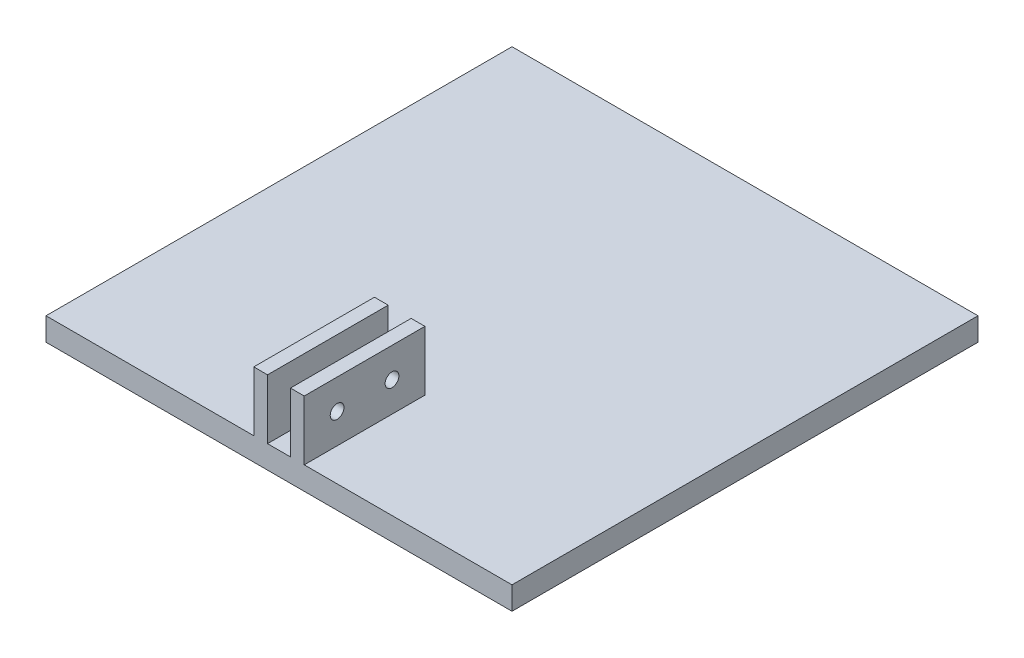
ISO-10303-21;
HEADER;
FILE_DESCRIPTION(('STEP AP214'),'2;1');
FILE_NAME('part.step','',(''),(''),'','','');
FILE_SCHEMA(('AUTOMOTIVE_DESIGN { 1 0 10303 214 1 1 1 1 }'));
ENDSEC;
DATA;
#1=APPLICATION_CONTEXT('core data for automotive mechanical design processes');
#2=APPLICATION_PROTOCOL_DEFINITION('international standard','automotive_design',2000,#1);
#3=PRODUCT_CONTEXT('',#1,'mechanical');
#4=PRODUCT('Part','Part','',(#3));
#5=PRODUCT_RELATED_PRODUCT_CATEGORY('part','',(#4));
#6=PRODUCT_DEFINITION_FORMATION('','',#4);
#7=PRODUCT_DEFINITION_CONTEXT('part definition',#1,'design');
#8=PRODUCT_DEFINITION('design','',#6,#7);
#9=PRODUCT_DEFINITION_SHAPE('','',#8);
#10=(LENGTH_UNIT() NAMED_UNIT(*) SI_UNIT(.MILLI.,.METRE.));
#11=(NAMED_UNIT(*) PLANE_ANGLE_UNIT() SI_UNIT($,.RADIAN.));
#12=(NAMED_UNIT(*) SI_UNIT($,.STERADIAN.) SOLID_ANGLE_UNIT());
#13=UNCERTAINTY_MEASURE_WITH_UNIT(LENGTH_MEASURE(1.E-05),#10,'distance_accuracy_value','');
#14=(GEOMETRIC_REPRESENTATION_CONTEXT(3) GLOBAL_UNCERTAINTY_ASSIGNED_CONTEXT((#13)) GLOBAL_UNIT_ASSIGNED_CONTEXT((#10,
#11,#12)) REPRESENTATION_CONTEXT('',''));
#15=CARTESIAN_POINT('',(0.,0.,0.));
#16=DIRECTION('',(0.,0.,1.));
#17=DIRECTION('',(1.,0.,0.));
#18=AXIS2_PLACEMENT_3D('',#15,#16,#17);
#19=CARTESIAN_POINT('',(0.,5.,0.));
#20=DIRECTION('',(0.,1.,0.));
#21=DIRECTION('',(0.,0.,1.));
#22=AXIS2_PLACEMENT_3D('',#19,#20,#21);
#23=PLANE('',#22);
#24=DIRECTION('',(-1.,0.,0.));
#25=VECTOR('',#24,1.);
#26=CARTESIAN_POINT('',(-2.49999999999997,5.,24.49));
#27=LINE('',#26,#25);
#28=CARTESIAN_POINT('',(-2.49999999999997,5.,24.49));
#29=VERTEX_POINT('',#28);
#30=CARTESIAN_POINT('',(-5.49999999999997,5.,24.49));
#31=VERTEX_POINT('',#30);
#32=EDGE_CURVE('E50',#29,#31,#27,.T.);
#33=ORIENTED_EDGE('',*,*,#32,.F.);
#34=DIRECTION('',(0.,0.,-1.));
#35=VECTOR('',#34,1.);
#36=CARTESIAN_POINT('',(-2.49999999999997,5.,50.8));
#37=LINE('',#36,#35);
#38=CARTESIAN_POINT('',(-2.49999999999997,5.,50.8));
#39=VERTEX_POINT('',#38);
#40=EDGE_CURVE('E144',#39,#29,#37,.T.);
#41=ORIENTED_EDGE('',*,*,#40,.F.);
#42=DIRECTION('',(1.,0.,0.));
#43=VECTOR('',#42,1.);
#44=CARTESIAN_POINT('',(50.8,5.,50.8));
#45=LINE('',#44,#43);
#46=CARTESIAN_POINT('',(2.5,5.,50.8));
#47=VERTEX_POINT('',#46);
#48=EDGE_CURVE('E189',#39,#47,#45,.T.);
#49=ORIENTED_EDGE('',*,*,#48,.T.);
#50=DIRECTION('',(0.,0.,1.));
#51=VECTOR('',#50,1.);
#52=CARTESIAN_POINT('',(2.5,5.,50.8));
#53=LINE('',#52,#51);
#54=CARTESIAN_POINT('',(2.5,5.,24.49));
#55=VERTEX_POINT('',#54);
#56=EDGE_CURVE('E145',#55,#47,#53,.T.);
#57=ORIENTED_EDGE('',*,*,#56,.F.);
#58=DIRECTION('',(-1.,0.,0.));
#59=VECTOR('',#58,1.);
#60=CARTESIAN_POINT('',(2.5,5.,24.49));
#61=LINE('',#60,#59);
#62=CARTESIAN_POINT('',(5.5,5.,24.49));
#63=VERTEX_POINT('',#62);
#64=EDGE_CURVE('E158',#63,#55,#61,.T.);
#65=ORIENTED_EDGE('',*,*,#64,.F.);
#66=DIRECTION('',(0.,0.,-1.));
#67=VECTOR('',#66,1.);
#68=CARTESIAN_POINT('',(5.5,5.,50.8));
#69=LINE('',#68,#67);
#70=CARTESIAN_POINT('',(5.5,5.,50.8));
#71=VERTEX_POINT('',#70);
#72=EDGE_CURVE('E148',#71,#63,#69,.T.);
#73=ORIENTED_EDGE('',*,*,#72,.F.);
#74=CARTESIAN_POINT('',(50.8,5.,50.8));
#75=VERTEX_POINT('',#74);
#76=EDGE_CURVE('E184',#71,#75,#45,.T.);
#77=ORIENTED_EDGE('',*,*,#76,.T.);
#78=DIRECTION('',(0.,0.,-1.));
#79=VECTOR('',#78,1.);
#80=CARTESIAN_POINT('',(50.8,5.,50.8));
#81=LINE('',#80,#79);
#82=CARTESIAN_POINT('',(50.8,5.,-50.8));
#83=VERTEX_POINT('',#82);
#84=EDGE_CURVE('E188',#75,#83,#81,.T.);
#85=ORIENTED_EDGE('',*,*,#84,.T.);
#86=DIRECTION('',(-1.,0.,0.));
#87=VECTOR('',#86,1.);
#88=CARTESIAN_POINT('',(50.8,5.,-50.8));
#89=LINE('',#88,#87);
#90=CARTESIAN_POINT('',(-50.8,5.,-50.8));
#91=VERTEX_POINT('',#90);
#92=EDGE_CURVE('E191',#83,#91,#89,.T.);
#93=ORIENTED_EDGE('',*,*,#92,.T.);
#94=DIRECTION('',(0.,0.,1.));
#95=VECTOR('',#94,1.);
#96=CARTESIAN_POINT('',(-50.8,5.,50.8));
#97=LINE('',#96,#95);
#98=CARTESIAN_POINT('',(-50.8,5.,50.8));
#99=VERTEX_POINT('',#98);
#100=EDGE_CURVE('E181',#91,#99,#97,.T.);
#101=ORIENTED_EDGE('',*,*,#100,.T.);
#102=CARTESIAN_POINT('',(-5.49999999999996,5.,50.8));
#103=VERTEX_POINT('',#102);
#104=EDGE_CURVE('E186',#99,#103,#45,.T.);
#105=ORIENTED_EDGE('',*,*,#104,.T.);
#106=DIRECTION('',(0.,0.,1.));
#107=VECTOR('',#106,1.);
#108=CARTESIAN_POINT('',(-5.49999999999997,5.,50.8));
#109=LINE('',#108,#107);
#110=EDGE_CURVE('E55',#31,#103,#109,.T.);
#111=ORIENTED_EDGE('',*,*,#110,.F.);
#112=EDGE_LOOP('',(#33,#41,#49,#57,#65,#73,#77,#85,#93,#101,#105,#111));
#113=FACE_BOUND('',#112,.T.);
#114=ADVANCED_FACE('F33',(#113),#23,.T.);
#115=CARTESIAN_POINT('',(-50.8,5.,50.8));
#116=DIRECTION('',(1.,0.,0.));
#117=DIRECTION('',(0.,0.,-1.));
#118=AXIS2_PLACEMENT_3D('',#115,#116,#117);
#119=PLANE('',#118);
#120=DIRECTION('',(0.,0.,1.));
#121=VECTOR('',#120,1.);
#122=CARTESIAN_POINT('',(-50.8,0.,50.8));
#123=LINE('',#122,#121);
#124=CARTESIAN_POINT('',(-50.8,0.,-50.8));
#125=VERTEX_POINT('',#124);
#126=CARTESIAN_POINT('',(-50.8,0.,50.8));
#127=VERTEX_POINT('',#126);
#128=EDGE_CURVE('E180',#125,#127,#123,.T.);
#129=ORIENTED_EDGE('',*,*,#128,.T.);
#130=DIRECTION('',(0.,-1.,0.));
#131=VECTOR('',#130,1.);
#132=CARTESIAN_POINT('',(-50.8,5.,50.8));
#133=LINE('',#132,#131);
#134=EDGE_CURVE('E11',#99,#127,#133,.T.);
#135=ORIENTED_EDGE('',*,*,#134,.F.);
#136=ORIENTED_EDGE('',*,*,#100,.F.);
#137=DIRECTION('',(0.,-1.,0.));
#138=VECTOR('',#137,1.);
#139=CARTESIAN_POINT('',(-50.8,5.,-50.8));
#140=LINE('',#139,#138);
#141=EDGE_CURVE('E193',#91,#125,#140,.T.);
#142=ORIENTED_EDGE('',*,*,#141,.T.);
#143=EDGE_LOOP('',(#129,#135,#136,#142));
#144=FACE_BOUND('',#143,.T.);
#145=ADVANCED_FACE('F35',(#144),#119,.F.);
#146=CARTESIAN_POINT('',(50.8,5.,50.8));
#147=DIRECTION('',(0.,0.,-1.));
#148=DIRECTION('',(-1.,0.,0.));
#149=AXIS2_PLACEMENT_3D('',#146,#147,#148);
#150=PLANE('',#149);
#151=DIRECTION('',(1.,0.,0.));
#152=VECTOR('',#151,1.);
#153=CARTESIAN_POINT('',(50.8,0.,50.8));
#154=LINE('',#153,#152);
#155=CARTESIAN_POINT('',(50.8,0.,50.8));
#156=VERTEX_POINT('',#155);
#157=EDGE_CURVE('E196',#127,#156,#154,.T.);
#158=ORIENTED_EDGE('',*,*,#157,.T.);
#159=DIRECTION('',(0.,-1.,0.));
#160=VECTOR('',#159,1.);
#161=CARTESIAN_POINT('',(50.8,5.,50.8));
#162=LINE('',#161,#160);
#163=EDGE_CURVE('E42',#75,#156,#162,.T.);
#164=ORIENTED_EDGE('',*,*,#163,.F.);
#165=ORIENTED_EDGE('',*,*,#76,.F.);
#166=DIRECTION('',(0.,-1.,0.));
#167=VECTOR('',#166,1.);
#168=CARTESIAN_POINT('',(5.5,18.,50.8));
#169=LINE('',#168,#167);
#170=CARTESIAN_POINT('',(5.5,18.,50.8));
#171=VERTEX_POINT('',#170);
#172=EDGE_CURVE('E174',#171,#71,#169,.T.);
#173=ORIENTED_EDGE('',*,*,#172,.F.);
#174=DIRECTION('',(1.,0.,0.));
#175=VECTOR('',#174,1.);
#176=CARTESIAN_POINT('',(2.5,18.,50.8));
#177=LINE('',#176,#175);
#178=CARTESIAN_POINT('',(2.5,18.,50.8));
#179=VERTEX_POINT('',#178);
#180=EDGE_CURVE('E157',#179,#171,#177,.T.);
#181=ORIENTED_EDGE('',*,*,#180,.F.);
#182=DIRECTION('',(0.,-1.,0.));
#183=VECTOR('',#182,1.);
#184=CARTESIAN_POINT('',(2.5,18.,50.8));
#185=LINE('',#184,#183);
#186=EDGE_CURVE('E177',#179,#47,#185,.T.);
#187=ORIENTED_EDGE('',*,*,#186,.T.);
#188=ORIENTED_EDGE('',*,*,#48,.F.);
#189=DIRECTION('',(0.,-1.,0.));
#190=VECTOR('',#189,1.);
#191=CARTESIAN_POINT('',(-2.49999999999997,18.,50.8));
#192=LINE('',#191,#190);
#193=CARTESIAN_POINT('',(-2.49999999999997,18.,50.8));
#194=VERTEX_POINT('',#193);
#195=EDGE_CURVE('E234',#194,#39,#192,.T.);
#196=ORIENTED_EDGE('',*,*,#195,.F.);
#197=DIRECTION('',(1.,0.,0.));
#198=VECTOR('',#197,1.);
#199=CARTESIAN_POINT('',(-2.49999999999997,18.,50.8));
#200=LINE('',#199,#198);
#201=CARTESIAN_POINT('',(-5.49999999999997,18.,50.8));
#202=VERTEX_POINT('',#201);
#203=EDGE_CURVE('E138',#202,#194,#200,.T.);
#204=ORIENTED_EDGE('',*,*,#203,.F.);
#205=DIRECTION('',(0.,-1.,0.));
#206=VECTOR('',#205,1.);
#207=CARTESIAN_POINT('',(-5.49999999999997,18.,50.8));
#208=LINE('',#207,#206);
#209=EDGE_CURVE('E150',#202,#103,#208,.T.);
#210=ORIENTED_EDGE('',*,*,#209,.T.);
#211=ORIENTED_EDGE('',*,*,#104,.F.);
#212=ORIENTED_EDGE('',*,*,#134,.T.);
#213=EDGE_LOOP('',(#158,#164,#165,#173,#181,#187,#188,#196,#204,#210,#211,#212));
#214=FACE_BOUND('',#213,.T.);
#215=ADVANCED_FACE('F241',(#214),#150,.F.);
#216=CARTESIAN_POINT('',(50.8,5.,50.8));
#217=DIRECTION('',(-1.,0.,0.));
#218=DIRECTION('',(0.,0.,1.));
#219=AXIS2_PLACEMENT_3D('',#216,#217,#218);
#220=PLANE('',#219);
#221=DIRECTION('',(0.,0.,-1.));
#222=VECTOR('',#221,1.);
#223=CARTESIAN_POINT('',(50.8,0.,50.8));
#224=LINE('',#223,#222);
#225=CARTESIAN_POINT('',(50.8,0.,-50.8));
#226=VERTEX_POINT('',#225);
#227=EDGE_CURVE('E198',#156,#226,#224,.T.);
#228=ORIENTED_EDGE('',*,*,#227,.T.);
#229=DIRECTION('',(0.,-1.,0.));
#230=VECTOR('',#229,1.);
#231=CARTESIAN_POINT('',(50.8,5.,-50.8));
#232=LINE('',#231,#230);
#233=EDGE_CURVE('E203',#83,#226,#232,.T.);
#234=ORIENTED_EDGE('',*,*,#233,.F.);
#235=ORIENTED_EDGE('',*,*,#84,.F.);
#236=ORIENTED_EDGE('',*,*,#163,.T.);
#237=EDGE_LOOP('',(#228,#234,#235,#236));
#238=FACE_BOUND('',#237,.T.);
#239=ADVANCED_FACE('F272',(#238),#220,.F.);
#240=CARTESIAN_POINT('',(50.8,5.,-50.8));
#241=DIRECTION('',(0.,0.,1.));
#242=DIRECTION('',(1.,0.,0.));
#243=AXIS2_PLACEMENT_3D('',#240,#241,#242);
#244=PLANE('',#243);
#245=DIRECTION('',(-1.,0.,0.));
#246=VECTOR('',#245,1.);
#247=CARTESIAN_POINT('',(50.8,0.,-50.8));
#248=LINE('',#247,#246);
#249=EDGE_CURVE('E185',#226,#125,#248,.T.);
#250=ORIENTED_EDGE('',*,*,#249,.T.);
#251=ORIENTED_EDGE('',*,*,#141,.F.);
#252=ORIENTED_EDGE('',*,*,#92,.F.);
#253=ORIENTED_EDGE('',*,*,#233,.T.);
#254=EDGE_LOOP('',(#250,#251,#252,#253));
#255=FACE_BOUND('',#254,.T.);
#256=ADVANCED_FACE('F268',(#255),#244,.F.);
#257=CARTESIAN_POINT('',(0.,0.,0.));
#258=DIRECTION('',(0.,1.,0.));
#259=DIRECTION('',(0.,0.,1.));
#260=AXIS2_PLACEMENT_3D('',#257,#258,#259);
#261=PLANE('',#260);
#262=ORIENTED_EDGE('',*,*,#128,.F.);
#263=ORIENTED_EDGE('',*,*,#249,.F.);
#264=ORIENTED_EDGE('',*,*,#227,.F.);
#265=ORIENTED_EDGE('',*,*,#157,.F.);
#266=EDGE_LOOP('',(#262,#263,#264,#265));
#267=FACE_BOUND('',#266,.T.);
#268=ADVANCED_FACE('F265',(#267),#261,.F.);
#269=CARTESIAN_POINT('',(2.5,18.,50.8));
#270=DIRECTION('',(1.,0.,0.));
#271=DIRECTION('',(0.,0.,-1.));
#272=AXIS2_PLACEMENT_3D('',#269,#270,#271);
#273=PLANE('',#272);
#274=CARTESIAN_POINT('',(2.5,11.5,43.63));
#275=DIRECTION('',(1.,0.,0.));
#276=DIRECTION('',(0.,0.,-1.));
#277=AXIS2_PLACEMENT_3D('',#274,#275,#276);
#278=CIRCLE('',#277,1.5);
#279=CARTESIAN_POINT('',(2.5,11.5,42.13));
#280=VERTEX_POINT('',#279);
#281=EDGE_CURVE('E229',#280,#280,#278,.T.);
#282=ORIENTED_EDGE('',*,*,#281,.T.);
#283=EDGE_LOOP('',(#282));
#284=FACE_BOUND('',#283,.T.);
#285=CARTESIAN_POINT('',(2.5,11.5,31.66));
#286=DIRECTION('',(1.,0.,0.));
#287=DIRECTION('',(0.,0.,-1.));
#288=AXIS2_PLACEMENT_3D('',#285,#286,#287);
#289=CIRCLE('',#288,1.5);
#290=CARTESIAN_POINT('',(2.5,11.5,30.16));
#291=VERTEX_POINT('',#290);
#292=EDGE_CURVE('E214',#291,#291,#289,.T.);
#293=ORIENTED_EDGE('',*,*,#292,.T.);
#294=EDGE_LOOP('',(#293));
#295=FACE_BOUND('',#294,.T.);
#296=ORIENTED_EDGE('',*,*,#56,.T.);
#297=ORIENTED_EDGE('',*,*,#186,.F.);
#298=DIRECTION('',(0.,0.,1.));
#299=VECTOR('',#298,1.);
#300=CARTESIAN_POINT('',(2.5,18.,50.8));
#301=LINE('',#300,#299);
#302=CARTESIAN_POINT('',(2.5,18.,24.49));
#303=VERTEX_POINT('',#302);
#304=EDGE_CURVE('E154',#303,#179,#301,.T.);
#305=ORIENTED_EDGE('',*,*,#304,.F.);
#306=DIRECTION('',(0.,-1.,0.));
#307=VECTOR('',#306,1.);
#308=CARTESIAN_POINT('',(2.5,18.,24.49));
#309=LINE('',#308,#307);
#310=EDGE_CURVE('E163',#303,#55,#309,.T.);
#311=ORIENTED_EDGE('',*,*,#310,.T.);
#312=EDGE_LOOP('',(#296,#297,#305,#311));
#313=FACE_BOUND('',#312,.T.);
#314=ADVANCED_FACE('F263',(#284,#295,#313),#273,.F.);
#315=CARTESIAN_POINT('',(5.5,18.,50.8));
#316=DIRECTION('',(-1.,0.,0.));
#317=DIRECTION('',(0.,0.,1.));
#318=AXIS2_PLACEMENT_3D('',#315,#316,#317);
#319=PLANE('',#318);
#320=CARTESIAN_POINT('',(5.5,11.5,43.63));
#321=DIRECTION('',(1.,0.,0.));
#322=DIRECTION('',(0.,0.,-1.));
#323=AXIS2_PLACEMENT_3D('',#320,#321,#322);
#324=CIRCLE('',#323,1.5);
#325=CARTESIAN_POINT('',(5.5,11.5,42.13));
#326=VERTEX_POINT('',#325);
#327=EDGE_CURVE('E210',#326,#326,#324,.T.);
#328=ORIENTED_EDGE('',*,*,#327,.F.);
#329=EDGE_LOOP('',(#328));
#330=FACE_BOUND('',#329,.T.);
#331=CARTESIAN_POINT('',(5.5,11.5,31.66));
#332=DIRECTION('',(1.,0.,0.));
#333=DIRECTION('',(0.,0.,-1.));
#334=AXIS2_PLACEMENT_3D('',#331,#332,#333);
#335=CIRCLE('',#334,1.5);
#336=CARTESIAN_POINT('',(5.5,11.5,30.16));
#337=VERTEX_POINT('',#336);
#338=EDGE_CURVE('E217',#337,#337,#335,.T.);
#339=ORIENTED_EDGE('',*,*,#338,.F.);
#340=EDGE_LOOP('',(#339));
#341=FACE_BOUND('',#340,.T.);
#342=ORIENTED_EDGE('',*,*,#72,.T.);
#343=DIRECTION('',(0.,-1.,0.));
#344=VECTOR('',#343,1.);
#345=CARTESIAN_POINT('',(5.5,18.,24.49));
#346=LINE('',#345,#344);
#347=CARTESIAN_POINT('',(5.5,18.,24.49));
#348=VERTEX_POINT('',#347);
#349=EDGE_CURVE('E171',#348,#63,#346,.T.);
#350=ORIENTED_EDGE('',*,*,#349,.F.);
#351=DIRECTION('',(0.,0.,-1.));
#352=VECTOR('',#351,1.);
#353=CARTESIAN_POINT('',(5.5,18.,50.8));
#354=LINE('',#353,#352);
#355=EDGE_CURVE('E160',#171,#348,#354,.T.);
#356=ORIENTED_EDGE('',*,*,#355,.F.);
#357=ORIENTED_EDGE('',*,*,#172,.T.);
#358=EDGE_LOOP('',(#342,#350,#356,#357));
#359=FACE_BOUND('',#358,.T.);
#360=ADVANCED_FACE('F300',(#330,#341,#359),#319,.F.);
#361=CARTESIAN_POINT('',(2.5,18.,24.49));
#362=DIRECTION('',(0.,0.,1.));
#363=DIRECTION('',(1.,0.,0.));
#364=AXIS2_PLACEMENT_3D('',#361,#362,#363);
#365=PLANE('',#364);
#366=ORIENTED_EDGE('',*,*,#64,.T.);
#367=ORIENTED_EDGE('',*,*,#310,.F.);
#368=DIRECTION('',(-1.,0.,0.));
#369=VECTOR('',#368,1.);
#370=CARTESIAN_POINT('',(2.5,18.,24.49));
#371=LINE('',#370,#369);
#372=EDGE_CURVE('E162',#348,#303,#371,.T.);
#373=ORIENTED_EDGE('',*,*,#372,.F.);
#374=ORIENTED_EDGE('',*,*,#349,.T.);
#375=EDGE_LOOP('',(#366,#367,#373,#374));
#376=FACE_BOUND('',#375,.T.);
#377=ADVANCED_FACE('F308',(#376),#365,.F.);
#378=CARTESIAN_POINT('',(0.,18.,0.));
#379=DIRECTION('',(0.,-1.,0.));
#380=DIRECTION('',(0.,0.,-1.));
#381=AXIS2_PLACEMENT_3D('',#378,#379,#380);
#382=PLANE('',#381);
#383=ORIENTED_EDGE('',*,*,#304,.T.);
#384=ORIENTED_EDGE('',*,*,#180,.T.);
#385=ORIENTED_EDGE('',*,*,#355,.T.);
#386=ORIENTED_EDGE('',*,*,#372,.T.);
#387=EDGE_LOOP('',(#383,#384,#385,#386));
#388=FACE_BOUND('',#387,.T.);
#389=ADVANCED_FACE('F315',(#388),#382,.F.);
#390=CARTESIAN_POINT('',(-2.49999999999997,18.,50.8));
#391=DIRECTION('',(-1.,0.,0.));
#392=DIRECTION('',(0.,0.,1.));
#393=AXIS2_PLACEMENT_3D('',#390,#391,#392);
#394=PLANE('',#393);
#395=CARTESIAN_POINT('',(-2.49999999999997,11.5,43.63));
#396=DIRECTION('',(-1.,0.,0.));
#397=DIRECTION('',(0.,0.,1.));
#398=AXIS2_PLACEMENT_3D('',#395,#396,#397);
#399=CIRCLE('',#398,1.5);
#400=CARTESIAN_POINT('',(-2.49999999999997,11.5,42.13));
#401=VERTEX_POINT('',#400);
#402=EDGE_CURVE('E226',#401,#401,#399,.T.);
#403=ORIENTED_EDGE('',*,*,#402,.T.);
#404=EDGE_LOOP('',(#403));
#405=FACE_BOUND('',#404,.T.);
#406=CARTESIAN_POINT('',(-2.49999999999997,11.5,31.66));
#407=DIRECTION('',(-1.,0.,0.));
#408=DIRECTION('',(0.,0.,1.));
#409=AXIS2_PLACEMENT_3D('',#406,#407,#408);
#410=CIRCLE('',#409,1.5);
#411=CARTESIAN_POINT('',(-2.49999999999997,11.5,30.16));
#412=VERTEX_POINT('',#411);
#413=EDGE_CURVE('E209',#412,#412,#410,.T.);
#414=ORIENTED_EDGE('',*,*,#413,.T.);
#415=EDGE_LOOP('',(#414));
#416=FACE_BOUND('',#415,.T.);
#417=ORIENTED_EDGE('',*,*,#40,.T.);
#418=DIRECTION('',(0.,-1.,0.));
#419=VECTOR('',#418,1.);
#420=CARTESIAN_POINT('',(-2.49999999999997,18.,24.49));
#421=LINE('',#420,#419);
#422=CARTESIAN_POINT('',(-2.49999999999997,18.,24.49));
#423=VERTEX_POINT('',#422);
#424=EDGE_CURVE('E126',#423,#29,#421,.T.);
#425=ORIENTED_EDGE('',*,*,#424,.F.);
#426=DIRECTION('',(0.,0.,-1.));
#427=VECTOR('',#426,1.);
#428=CARTESIAN_POINT('',(-2.49999999999997,18.,50.8));
#429=LINE('',#428,#427);
#430=EDGE_CURVE('E133',#194,#423,#429,.T.);
#431=ORIENTED_EDGE('',*,*,#430,.F.);
#432=ORIENTED_EDGE('',*,*,#195,.T.);
#433=EDGE_LOOP('',(#417,#425,#431,#432));
#434=FACE_BOUND('',#433,.T.);
#435=ADVANCED_FACE('F143',(#405,#416,#434),#394,.F.);
#436=CARTESIAN_POINT('',(-2.49999999999997,18.,24.49));
#437=DIRECTION('',(0.,0.,1.));
#438=DIRECTION('',(1.,0.,0.));
#439=AXIS2_PLACEMENT_3D('',#436,#437,#438);
#440=PLANE('',#439);
#441=ORIENTED_EDGE('',*,*,#32,.T.);
#442=DIRECTION('',(0.,-1.,0.));
#443=VECTOR('',#442,1.);
#444=CARTESIAN_POINT('',(-5.49999999999997,18.,24.49));
#445=LINE('',#444,#443);
#446=CARTESIAN_POINT('',(-5.49999999999997,18.,24.49));
#447=VERTEX_POINT('',#446);
#448=EDGE_CURVE('E129',#447,#31,#445,.T.);
#449=ORIENTED_EDGE('',*,*,#448,.F.);
#450=DIRECTION('',(-1.,0.,0.));
#451=VECTOR('',#450,1.);
#452=CARTESIAN_POINT('',(-2.49999999999997,18.,24.49));
#453=LINE('',#452,#451);
#454=EDGE_CURVE('E122',#423,#447,#453,.T.);
#455=ORIENTED_EDGE('',*,*,#454,.F.);
#456=ORIENTED_EDGE('',*,*,#424,.T.);
#457=EDGE_LOOP('',(#441,#449,#455,#456));
#458=FACE_BOUND('',#457,.T.);
#459=ADVANCED_FACE('F124',(#458),#440,.F.);
#460=CARTESIAN_POINT('',(-5.49999999999997,18.,50.8));
#461=DIRECTION('',(1.,0.,0.));
#462=DIRECTION('',(0.,0.,-1.));
#463=AXIS2_PLACEMENT_3D('',#460,#461,#462);
#464=PLANE('',#463);
#465=CARTESIAN_POINT('',(-5.49999999999997,11.5,43.63));
#466=DIRECTION('',(1.,0.,0.));
#467=DIRECTION('',(0.,0.,-1.));
#468=AXIS2_PLACEMENT_3D('',#465,#466,#467);
#469=CIRCLE('',#468,1.5);
#470=CARTESIAN_POINT('',(-5.49999999999997,11.5,42.13));
#471=VERTEX_POINT('',#470);
#472=EDGE_CURVE('E37',#471,#471,#469,.T.);
#473=ORIENTED_EDGE('',*,*,#472,.T.);
#474=EDGE_LOOP('',(#473));
#475=FACE_BOUND('',#474,.T.);
#476=CARTESIAN_POINT('',(-5.49999999999997,11.5,31.66));
#477=DIRECTION('',(1.,0.,0.));
#478=DIRECTION('',(0.,0.,-1.));
#479=AXIS2_PLACEMENT_3D('',#476,#477,#478);
#480=CIRCLE('',#479,1.5);
#481=CARTESIAN_POINT('',(-5.49999999999997,11.5,30.16));
#482=VERTEX_POINT('',#481);
#483=EDGE_CURVE('E207',#482,#482,#480,.T.);
#484=ORIENTED_EDGE('',*,*,#483,.T.);
#485=EDGE_LOOP('',(#484));
#486=FACE_BOUND('',#485,.T.);
#487=ORIENTED_EDGE('',*,*,#110,.T.);
#488=ORIENTED_EDGE('',*,*,#209,.F.);
#489=DIRECTION('',(0.,0.,1.));
#490=VECTOR('',#489,1.);
#491=CARTESIAN_POINT('',(-5.49999999999997,18.,50.8));
#492=LINE('',#491,#490);
#493=EDGE_CURVE('E132',#447,#202,#492,.T.);
#494=ORIENTED_EDGE('',*,*,#493,.F.);
#495=ORIENTED_EDGE('',*,*,#448,.T.);
#496=EDGE_LOOP('',(#487,#488,#494,#495));
#497=FACE_BOUND('',#496,.T.);
#498=ADVANCED_FACE('F243',(#475,#486,#497),#464,.F.);
#499=CARTESIAN_POINT('',(0.,18.,0.));
#500=DIRECTION('',(0.,1.,0.));
#501=DIRECTION('',(0.,0.,1.));
#502=AXIS2_PLACEMENT_3D('',#499,#500,#501);
#503=PLANE('',#502);
#504=ORIENTED_EDGE('',*,*,#430,.T.);
#505=ORIENTED_EDGE('',*,*,#454,.T.);
#506=ORIENTED_EDGE('',*,*,#493,.T.);
#507=ORIENTED_EDGE('',*,*,#203,.T.);
#508=EDGE_LOOP('',(#504,#505,#506,#507));
#509=FACE_BOUND('',#508,.T.);
#510=ADVANCED_FACE('F136',(#509),#503,.T.);
#511=CARTESIAN_POINT('',(-7.5,11.5,31.66));
#512=DIRECTION('',(1.,0.,0.));
#513=DIRECTION('',(0.,0.,-1.));
#514=AXIS2_PLACEMENT_3D('',#511,#512,#513);
#515=CYLINDRICAL_SURFACE('',#514,1.5);
#516=CARTESIAN_POINT('',(-5.49999999999997,11.5,30.16));
#517=CARTESIAN_POINT('',(-5.46874999999997,11.5,30.16));
#518=CARTESIAN_POINT('',(-5.43749999999997,11.5,30.16));
#519=CARTESIAN_POINT('',(-5.37499999999997,11.5,30.16));
#520=CARTESIAN_POINT('',(-5.34374999999997,11.5,30.16));
#521=CARTESIAN_POINT('',(-5.28124999999997,11.5,30.16));
#522=CARTESIAN_POINT('',(-5.24999999999997,11.5,30.16));
#523=CARTESIAN_POINT('',(-5.18749999999997,11.5,30.16));
#524=CARTESIAN_POINT('',(-5.15624999999997,11.5,30.16));
#525=CARTESIAN_POINT('',(-5.09374999999997,11.5,30.16));
#526=CARTESIAN_POINT('',(-5.06249999999997,11.5,30.16));
#527=CARTESIAN_POINT('',(-4.99999999999997,11.5,30.16));
#528=CARTESIAN_POINT('',(-4.96874999999997,11.5,30.16));
#529=CARTESIAN_POINT('',(-4.90624999999997,11.5,30.16));
#530=CARTESIAN_POINT('',(-4.87499999999997,11.5,30.16));
#531=CARTESIAN_POINT('',(-4.81249999999997,11.5,30.16));
#532=CARTESIAN_POINT('',(-4.78124999999997,11.5,30.16));
#533=CARTESIAN_POINT('',(-4.71874999999997,11.5,30.16));
#534=CARTESIAN_POINT('',(-4.68749999999997,11.5,30.16));
#535=CARTESIAN_POINT('',(-4.62499999999997,11.5,30.16));
#536=CARTESIAN_POINT('',(-4.59374999999997,11.5,30.16));
#537=CARTESIAN_POINT('',(-4.53124999999997,11.5,30.16));
#538=CARTESIAN_POINT('',(-4.49999999999997,11.5,30.16));
#539=CARTESIAN_POINT('',(-4.43749999999997,11.5,30.16));
#540=CARTESIAN_POINT('',(-4.40624999999997,11.5,30.16));
#541=CARTESIAN_POINT('',(-4.34374999999997,11.5,30.16));
#542=CARTESIAN_POINT('',(-4.31249999999997,11.5,30.16));
#543=CARTESIAN_POINT('',(-4.24999999999997,11.5,30.16));
#544=CARTESIAN_POINT('',(-4.21874999999997,11.5,30.16));
#545=CARTESIAN_POINT('',(-4.15624999999997,11.5,30.16));
#546=CARTESIAN_POINT('',(-4.12499999999997,11.5,30.16));
#547=CARTESIAN_POINT('',(-4.06249999999997,11.5,30.16));
#548=CARTESIAN_POINT('',(-4.03124999999997,11.5,30.16));
#549=CARTESIAN_POINT('',(-3.96874999999997,11.5,30.16));
#550=CARTESIAN_POINT('',(-3.93749999999997,11.5,30.16));
#551=CARTESIAN_POINT('',(-3.87499999999997,11.5,30.16));
#552=CARTESIAN_POINT('',(-3.84374999999997,11.5,30.16));
#553=CARTESIAN_POINT('',(-3.78124999999997,11.5,30.16));
#554=CARTESIAN_POINT('',(-3.74999999999997,11.5,30.16));
#555=CARTESIAN_POINT('',(-3.68749999999997,11.5,30.16));
#556=CARTESIAN_POINT('',(-3.65624999999997,11.5,30.16));
#557=CARTESIAN_POINT('',(-3.59374999999997,11.5,30.16));
#558=CARTESIAN_POINT('',(-3.56249999999997,11.5,30.16));
#559=CARTESIAN_POINT('',(-3.49999999999997,11.5,30.16));
#560=CARTESIAN_POINT('',(-3.46874999999997,11.5,30.16));
#561=CARTESIAN_POINT('',(-3.40624999999997,11.5,30.16));
#562=CARTESIAN_POINT('',(-3.37499999999997,11.5,30.16));
#563=CARTESIAN_POINT('',(-3.31249999999997,11.5,30.16));
#564=CARTESIAN_POINT('',(-3.28124999999997,11.5,30.16));
#565=CARTESIAN_POINT('',(-3.21874999999997,11.5,30.16));
#566=CARTESIAN_POINT('',(-3.18749999999997,11.5,30.16));
#567=CARTESIAN_POINT('',(-3.12499999999997,11.5,30.16));
#568=CARTESIAN_POINT('',(-3.09374999999997,11.5,30.16));
#569=CARTESIAN_POINT('',(-3.03124999999997,11.5,30.16));
#570=CARTESIAN_POINT('',(-2.99999999999997,11.5,30.16));
#571=CARTESIAN_POINT('',(-2.93749999999997,11.5,30.16));
#572=CARTESIAN_POINT('',(-2.90624999999997,11.5,30.16));
#573=CARTESIAN_POINT('',(-2.84374999999997,11.5,30.16));
#574=CARTESIAN_POINT('',(-2.81249999999997,11.5,30.16));
#575=CARTESIAN_POINT('',(-2.74999999999997,11.5,30.16));
#576=CARTESIAN_POINT('',(-2.71874999999997,11.5,30.16));
#577=CARTESIAN_POINT('',(-2.65624999999997,11.5,30.16));
#578=CARTESIAN_POINT('',(-2.62499999999997,11.5,30.16));
#579=CARTESIAN_POINT('',(-2.56249999999997,11.5,30.16));
#580=CARTESIAN_POINT('',(-2.53124999999997,11.5,30.16));
#581=CARTESIAN_POINT('',(-2.49999999999997,11.5,30.16));
#582=B_SPLINE_CURVE_WITH_KNOTS('',3,(#516,#517,#518,#519,#520,#521,#522,#523,#524,#525,#526,
#527,#528,#529,#530,#531,#532,#533,#534,#535,#536,#537,#538,#539,#540,#541,#542,#543,#544,#545,
#546,#547,#548,#549,#550,#551,#552,#553,#554,#555,#556,#557,#558,#559,#560,#561,#562,#563,#564,
#565,#566,#567,#568,#569,#570,#571,#572,#573,#574,#575,#576,#577,#578,#579,#580,#581),
.UNSPECIFIED.,.F.,.F.,(4,2,2,2,2,2,2,2,2,2,2,2,2,2,2,2,2,2,2,2,2,2,2,2,2,2,2,2,2,2,2,2,4),(0.,
0.0937500000000001,0.1875,0.281249999999999,0.374999999999999,0.46875,0.562499999999999,
0.656249999999999,0.749999999999999,0.843749999999999,0.937499999999999,1.03125,1.125,1.21875,
1.3125,1.40625,1.5,1.59375,1.6875,1.78125,1.875,1.96875,2.0625,2.15625,2.25,2.34375,2.4375,
2.53125,2.625,2.71875,2.8125,2.90625,3.),.UNSPECIFIED.);
#583=EDGE_CURVE('BSEAM251',#482,#412,#582,.T.);
#584=ORIENTED_EDGE('',*,*,#483,.F.);
#585=ORIENTED_EDGE('',*,*,#413,.F.);
#586=ORIENTED_EDGE('',*,*,#583,.T.);
#587=ORIENTED_EDGE('',*,*,#583,.F.);
#588=EDGE_LOOP('',(#584,#586,#585,#587));
#589=FACE_BOUND('',#588,.T.);
#590=ADVANCED_FACE('F251',(#589),#515,.F.);
#591=CARTESIAN_POINT('',(-7.5,11.5,43.63));
#592=DIRECTION('',(1.,0.,0.));
#593=DIRECTION('',(0.,0.,-1.));
#594=AXIS2_PLACEMENT_3D('',#591,#592,#593);
#595=CYLINDRICAL_SURFACE('',#594,1.5);
#596=CARTESIAN_POINT('',(-5.49999999999997,11.5,42.13));
#597=CARTESIAN_POINT('',(-5.46874999999997,11.5,42.13));
#598=CARTESIAN_POINT('',(-5.43749999999997,11.5,42.13));
#599=CARTESIAN_POINT('',(-5.37499999999997,11.5,42.13));
#600=CARTESIAN_POINT('',(-5.34374999999997,11.5,42.13));
#601=CARTESIAN_POINT('',(-5.28124999999997,11.5,42.13));
#602=CARTESIAN_POINT('',(-5.24999999999997,11.5,42.13));
#603=CARTESIAN_POINT('',(-5.18749999999997,11.5,42.13));
#604=CARTESIAN_POINT('',(-5.15624999999997,11.5,42.13));
#605=CARTESIAN_POINT('',(-5.09374999999997,11.5,42.13));
#606=CARTESIAN_POINT('',(-5.06249999999997,11.5,42.13));
#607=CARTESIAN_POINT('',(-4.99999999999997,11.5,42.13));
#608=CARTESIAN_POINT('',(-4.96874999999997,11.5,42.13));
#609=CARTESIAN_POINT('',(-4.90624999999997,11.5,42.13));
#610=CARTESIAN_POINT('',(-4.87499999999997,11.5,42.13));
#611=CARTESIAN_POINT('',(-4.81249999999997,11.5,42.13));
#612=CARTESIAN_POINT('',(-4.78124999999997,11.5,42.13));
#613=CARTESIAN_POINT('',(-4.71874999999997,11.5,42.13));
#614=CARTESIAN_POINT('',(-4.68749999999997,11.5,42.13));
#615=CARTESIAN_POINT('',(-4.62499999999997,11.5,42.13));
#616=CARTESIAN_POINT('',(-4.59374999999997,11.5,42.13));
#617=CARTESIAN_POINT('',(-4.53124999999997,11.5,42.13));
#618=CARTESIAN_POINT('',(-4.49999999999997,11.5,42.13));
#619=CARTESIAN_POINT('',(-4.43749999999997,11.5,42.13));
#620=CARTESIAN_POINT('',(-4.40624999999997,11.5,42.13));
#621=CARTESIAN_POINT('',(-4.34374999999997,11.5,42.13));
#622=CARTESIAN_POINT('',(-4.31249999999997,11.5,42.13));
#623=CARTESIAN_POINT('',(-4.24999999999997,11.5,42.13));
#624=CARTESIAN_POINT('',(-4.21874999999997,11.5,42.13));
#625=CARTESIAN_POINT('',(-4.15624999999997,11.5,42.13));
#626=CARTESIAN_POINT('',(-4.12499999999997,11.5,42.13));
#627=CARTESIAN_POINT('',(-4.06249999999997,11.5,42.13));
#628=CARTESIAN_POINT('',(-4.03124999999997,11.5,42.13));
#629=CARTESIAN_POINT('',(-3.96874999999997,11.5,42.13));
#630=CARTESIAN_POINT('',(-3.93749999999997,11.5,42.13));
#631=CARTESIAN_POINT('',(-3.87499999999997,11.5,42.13));
#632=CARTESIAN_POINT('',(-3.84374999999997,11.5,42.13));
#633=CARTESIAN_POINT('',(-3.78124999999997,11.5,42.13));
#634=CARTESIAN_POINT('',(-3.74999999999997,11.5,42.13));
#635=CARTESIAN_POINT('',(-3.68749999999997,11.5,42.13));
#636=CARTESIAN_POINT('',(-3.65624999999997,11.5,42.13));
#637=CARTESIAN_POINT('',(-3.59374999999997,11.5,42.13));
#638=CARTESIAN_POINT('',(-3.56249999999997,11.5,42.13));
#639=CARTESIAN_POINT('',(-3.49999999999997,11.5,42.13));
#640=CARTESIAN_POINT('',(-3.46874999999997,11.5,42.13));
#641=CARTESIAN_POINT('',(-3.40624999999997,11.5,42.13));
#642=CARTESIAN_POINT('',(-3.37499999999997,11.5,42.13));
#643=CARTESIAN_POINT('',(-3.31249999999997,11.5,42.13));
#644=CARTESIAN_POINT('',(-3.28124999999997,11.5,42.13));
#645=CARTESIAN_POINT('',(-3.21874999999997,11.5,42.13));
#646=CARTESIAN_POINT('',(-3.18749999999997,11.5,42.13));
#647=CARTESIAN_POINT('',(-3.12499999999997,11.5,42.13));
#648=CARTESIAN_POINT('',(-3.09374999999997,11.5,42.13));
#649=CARTESIAN_POINT('',(-3.03124999999997,11.5,42.13));
#650=CARTESIAN_POINT('',(-2.99999999999997,11.5,42.13));
#651=CARTESIAN_POINT('',(-2.93749999999997,11.5,42.13));
#652=CARTESIAN_POINT('',(-2.90624999999997,11.5,42.13));
#653=CARTESIAN_POINT('',(-2.84374999999997,11.5,42.13));
#654=CARTESIAN_POINT('',(-2.81249999999997,11.5,42.13));
#655=CARTESIAN_POINT('',(-2.74999999999997,11.5,42.13));
#656=CARTESIAN_POINT('',(-2.71874999999997,11.5,42.13));
#657=CARTESIAN_POINT('',(-2.65624999999997,11.5,42.13));
#658=CARTESIAN_POINT('',(-2.62499999999997,11.5,42.13));
#659=CARTESIAN_POINT('',(-2.56249999999997,11.5,42.13));
#660=CARTESIAN_POINT('',(-2.53124999999997,11.5,42.13));
#661=CARTESIAN_POINT('',(-2.49999999999997,11.5,42.13));
#662=B_SPLINE_CURVE_WITH_KNOTS('',3,(#596,#597,#598,#599,#600,#601,#602,#603,#604,#605,#606,
#607,#608,#609,#610,#611,#612,#613,#614,#615,#616,#617,#618,#619,#620,#621,#622,#623,#624,#625,
#626,#627,#628,#629,#630,#631,#632,#633,#634,#635,#636,#637,#638,#639,#640,#641,#642,#643,#644,
#645,#646,#647,#648,#649,#650,#651,#652,#653,#654,#655,#656,#657,#658,#659,#660,#661),
.UNSPECIFIED.,.F.,.F.,(4,2,2,2,2,2,2,2,2,2,2,2,2,2,2,2,2,2,2,2,2,2,2,2,2,2,2,2,2,2,2,2,4),(0.,
0.0937500000000001,0.1875,0.281249999999999,0.374999999999999,0.46875,0.562499999999999,
0.656249999999999,0.749999999999999,0.843749999999999,0.937499999999999,1.03125,1.125,1.21875,
1.3125,1.40625,1.5,1.59375,1.6875,1.78125,1.875,1.96875,2.0625,2.15625,2.25,2.34375,2.4375,
2.53125,2.625,2.71875,2.8125,2.90625,3.),.UNSPECIFIED.);
#663=EDGE_CURVE('BSEAM349',#471,#401,#662,.T.);
#664=ORIENTED_EDGE('',*,*,#472,.F.);
#665=ORIENTED_EDGE('',*,*,#402,.F.);
#666=ORIENTED_EDGE('',*,*,#663,.T.);
#667=ORIENTED_EDGE('',*,*,#663,.F.);
#668=EDGE_LOOP('',(#664,#666,#665,#667));
#669=FACE_BOUND('',#668,.T.);
#670=ADVANCED_FACE('F349',(#669),#595,.F.);
#671=CARTESIAN_POINT('',(5.5,11.5,30.16));
#672=CARTESIAN_POINT('',(5.46875,11.5,30.16));
#673=CARTESIAN_POINT('',(5.4375,11.5,30.16));
#674=CARTESIAN_POINT('',(5.375,11.5,30.16));
#675=CARTESIAN_POINT('',(5.34375,11.5,30.16));
#676=CARTESIAN_POINT('',(5.28125,11.5,30.16));
#677=CARTESIAN_POINT('',(5.25,11.5,30.16));
#678=CARTESIAN_POINT('',(5.1875,11.5,30.16));
#679=CARTESIAN_POINT('',(5.15625,11.5,30.16));
#680=CARTESIAN_POINT('',(5.09375,11.5,30.16));
#681=CARTESIAN_POINT('',(5.0625,11.5,30.16));
#682=CARTESIAN_POINT('',(5.,11.5,30.16));
#683=CARTESIAN_POINT('',(4.96875,11.5,30.16));
#684=CARTESIAN_POINT('',(4.90625,11.5,30.16));
#685=CARTESIAN_POINT('',(4.875,11.5,30.16));
#686=CARTESIAN_POINT('',(4.8125,11.5,30.16));
#687=CARTESIAN_POINT('',(4.78125,11.5,30.16));
#688=CARTESIAN_POINT('',(4.71875,11.5,30.16));
#689=CARTESIAN_POINT('',(4.6875,11.5,30.16));
#690=CARTESIAN_POINT('',(4.625,11.5,30.16));
#691=CARTESIAN_POINT('',(4.59375,11.5,30.16));
#692=CARTESIAN_POINT('',(4.53125,11.5,30.16));
#693=CARTESIAN_POINT('',(4.5,11.5,30.16));
#694=CARTESIAN_POINT('',(4.4375,11.5,30.16));
#695=CARTESIAN_POINT('',(4.40625,11.5,30.16));
#696=CARTESIAN_POINT('',(4.34375,11.5,30.16));
#697=CARTESIAN_POINT('',(4.3125,11.5,30.16));
#698=CARTESIAN_POINT('',(4.25,11.5,30.16));
#699=CARTESIAN_POINT('',(4.21875,11.5,30.16));
#700=CARTESIAN_POINT('',(4.15625,11.5,30.16));
#701=CARTESIAN_POINT('',(4.125,11.5,30.16));
#702=CARTESIAN_POINT('',(4.0625,11.5,30.16));
#703=CARTESIAN_POINT('',(4.03125,11.5,30.16));
#704=CARTESIAN_POINT('',(3.96875,11.5,30.16));
#705=CARTESIAN_POINT('',(3.9375,11.5,30.16));
#706=CARTESIAN_POINT('',(3.875,11.5,30.16));
#707=CARTESIAN_POINT('',(3.84375,11.5,30.16));
#708=CARTESIAN_POINT('',(3.78125,11.5,30.16));
#709=CARTESIAN_POINT('',(3.75,11.5,30.16));
#710=CARTESIAN_POINT('',(3.6875,11.5,30.16));
#711=CARTESIAN_POINT('',(3.65625,11.5,30.16));
#712=CARTESIAN_POINT('',(3.59375,11.5,30.16));
#713=CARTESIAN_POINT('',(3.5625,11.5,30.16));
#714=CARTESIAN_POINT('',(3.5,11.5,30.16));
#715=CARTESIAN_POINT('',(3.46875,11.5,30.16));
#716=CARTESIAN_POINT('',(3.40625,11.5,30.16));
#717=CARTESIAN_POINT('',(3.375,11.5,30.16));
#718=CARTESIAN_POINT('',(3.3125,11.5,30.16));
#719=CARTESIAN_POINT('',(3.28125,11.5,30.16));
#720=CARTESIAN_POINT('',(3.21875,11.5,30.16));
#721=CARTESIAN_POINT('',(3.1875,11.5,30.16));
#722=CARTESIAN_POINT('',(3.125,11.5,30.16));
#723=CARTESIAN_POINT('',(3.09375,11.5,30.16));
#724=CARTESIAN_POINT('',(3.03125,11.5,30.16));
#725=CARTESIAN_POINT('',(3.,11.5,30.16));
#726=CARTESIAN_POINT('',(2.9375,11.5,30.16));
#727=CARTESIAN_POINT('',(2.90625,11.5,30.16));
#728=CARTESIAN_POINT('',(2.84375,11.5,30.16));
#729=CARTESIAN_POINT('',(2.8125,11.5,30.16));
#730=CARTESIAN_POINT('',(2.75,11.5,30.16));
#731=CARTESIAN_POINT('',(2.71875,11.5,30.16));
#732=CARTESIAN_POINT('',(2.65625,11.5,30.16));
#733=CARTESIAN_POINT('',(2.625,11.5,30.16));
#734=CARTESIAN_POINT('',(2.5625,11.5,30.16));
#735=CARTESIAN_POINT('',(2.53125,11.5,30.16));
#736=CARTESIAN_POINT('',(2.5,11.5,30.16));
#737=B_SPLINE_CURVE_WITH_KNOTS('',3,(#671,#672,#673,#674,#675,#676,#677,#678,#679,#680,#681,
#682,#683,#684,#685,#686,#687,#688,#689,#690,#691,#692,#693,#694,#695,#696,#697,#698,#699,#700,
#701,#702,#703,#704,#705,#706,#707,#708,#709,#710,#711,#712,#713,#714,#715,#716,#717,#718,#719,
#720,#721,#722,#723,#724,#725,#726,#727,#728,#729,#730,#731,#732,#733,#734,#735,#736),
.UNSPECIFIED.,.F.,.F.,(4,2,2,2,2,2,2,2,2,2,2,2,2,2,2,2,2,2,2,2,2,2,2,2,2,2,2,2,2,2,2,2,4),(0.,
0.0937500000000001,0.1875,0.28125,0.375,0.46875,0.5625,0.656250000000001,0.750000000000001,
0.843749999999999,0.937499999999999,1.03125,1.125,1.21875,1.3125,1.40625,1.5,1.59375,1.6875,
1.78125,1.875,1.96875,2.0625,2.15625,2.25,2.34375,2.4375,2.53125,2.625,2.71875,2.8125,2.90625,
3.),.UNSPECIFIED.);
#738=EDGE_CURVE('BSEAM352',#337,#291,#737,.T.);
#739=ORIENTED_EDGE('',*,*,#338,.T.);
#740=ORIENTED_EDGE('',*,*,#292,.F.);
#741=ORIENTED_EDGE('',*,*,#738,.T.);
#742=ORIENTED_EDGE('',*,*,#738,.F.);
#743=EDGE_LOOP('',(#739,#741,#740,#742));
#744=FACE_BOUND('',#743,.T.);
#745=ADVANCED_FACE('F352',(#744),#515,.F.);
#746=CARTESIAN_POINT('',(5.5,11.5,42.13));
#747=CARTESIAN_POINT('',(5.46875,11.5,42.13));
#748=CARTESIAN_POINT('',(5.4375,11.5,42.13));
#749=CARTESIAN_POINT('',(5.375,11.5,42.13));
#750=CARTESIAN_POINT('',(5.34375,11.5,42.13));
#751=CARTESIAN_POINT('',(5.28125,11.5,42.13));
#752=CARTESIAN_POINT('',(5.25,11.5,42.13));
#753=CARTESIAN_POINT('',(5.1875,11.5,42.13));
#754=CARTESIAN_POINT('',(5.15625,11.5,42.13));
#755=CARTESIAN_POINT('',(5.09375,11.5,42.13));
#756=CARTESIAN_POINT('',(5.0625,11.5,42.13));
#757=CARTESIAN_POINT('',(5.,11.5,42.13));
#758=CARTESIAN_POINT('',(4.96875,11.5,42.13));
#759=CARTESIAN_POINT('',(4.90625,11.5,42.13));
#760=CARTESIAN_POINT('',(4.875,11.5,42.13));
#761=CARTESIAN_POINT('',(4.8125,11.5,42.13));
#762=CARTESIAN_POINT('',(4.78125,11.5,42.13));
#763=CARTESIAN_POINT('',(4.71875,11.5,42.13));
#764=CARTESIAN_POINT('',(4.6875,11.5,42.13));
#765=CARTESIAN_POINT('',(4.625,11.5,42.13));
#766=CARTESIAN_POINT('',(4.59375,11.5,42.13));
#767=CARTESIAN_POINT('',(4.53125,11.5,42.13));
#768=CARTESIAN_POINT('',(4.5,11.5,42.13));
#769=CARTESIAN_POINT('',(4.4375,11.5,42.13));
#770=CARTESIAN_POINT('',(4.40625,11.5,42.13));
#771=CARTESIAN_POINT('',(4.34375,11.5,42.13));
#772=CARTESIAN_POINT('',(4.3125,11.5,42.13));
#773=CARTESIAN_POINT('',(4.25,11.5,42.13));
#774=CARTESIAN_POINT('',(4.21875,11.5,42.13));
#775=CARTESIAN_POINT('',(4.15625,11.5,42.13));
#776=CARTESIAN_POINT('',(4.125,11.5,42.13));
#777=CARTESIAN_POINT('',(4.0625,11.5,42.13));
#778=CARTESIAN_POINT('',(4.03125,11.5,42.13));
#779=CARTESIAN_POINT('',(3.96875,11.5,42.13));
#780=CARTESIAN_POINT('',(3.9375,11.5,42.13));
#781=CARTESIAN_POINT('',(3.875,11.5,42.13));
#782=CARTESIAN_POINT('',(3.84375,11.5,42.13));
#783=CARTESIAN_POINT('',(3.78125,11.5,42.13));
#784=CARTESIAN_POINT('',(3.75,11.5,42.13));
#785=CARTESIAN_POINT('',(3.6875,11.5,42.13));
#786=CARTESIAN_POINT('',(3.65625,11.5,42.13));
#787=CARTESIAN_POINT('',(3.59375,11.5,42.13));
#788=CARTESIAN_POINT('',(3.5625,11.5,42.13));
#789=CARTESIAN_POINT('',(3.5,11.5,42.13));
#790=CARTESIAN_POINT('',(3.46875,11.5,42.13));
#791=CARTESIAN_POINT('',(3.40625,11.5,42.13));
#792=CARTESIAN_POINT('',(3.375,11.5,42.13));
#793=CARTESIAN_POINT('',(3.3125,11.5,42.13));
#794=CARTESIAN_POINT('',(3.28125,11.5,42.13));
#795=CARTESIAN_POINT('',(3.21875,11.5,42.13));
#796=CARTESIAN_POINT('',(3.1875,11.5,42.13));
#797=CARTESIAN_POINT('',(3.125,11.5,42.13));
#798=CARTESIAN_POINT('',(3.09375,11.5,42.13));
#799=CARTESIAN_POINT('',(3.03125,11.5,42.13));
#800=CARTESIAN_POINT('',(3.,11.5,42.13));
#801=CARTESIAN_POINT('',(2.9375,11.5,42.13));
#802=CARTESIAN_POINT('',(2.90625,11.5,42.13));
#803=CARTESIAN_POINT('',(2.84375,11.5,42.13));
#804=CARTESIAN_POINT('',(2.8125,11.5,42.13));
#805=CARTESIAN_POINT('',(2.75,11.5,42.13));
#806=CARTESIAN_POINT('',(2.71875,11.5,42.13));
#807=CARTESIAN_POINT('',(2.65625,11.5,42.13));
#808=CARTESIAN_POINT('',(2.625,11.5,42.13));
#809=CARTESIAN_POINT('',(2.5625,11.5,42.13));
#810=CARTESIAN_POINT('',(2.53125,11.5,42.13));
#811=CARTESIAN_POINT('',(2.5,11.5,42.13));
#812=B_SPLINE_CURVE_WITH_KNOTS('',3,(#746,#747,#748,#749,#750,#751,#752,#753,#754,#755,#756,
#757,#758,#759,#760,#761,#762,#763,#764,#765,#766,#767,#768,#769,#770,#771,#772,#773,#774,#775,
#776,#777,#778,#779,#780,#781,#782,#783,#784,#785,#786,#787,#788,#789,#790,#791,#792,#793,#794,
#795,#796,#797,#798,#799,#800,#801,#802,#803,#804,#805,#806,#807,#808,#809,#810,#811),
.UNSPECIFIED.,.F.,.F.,(4,2,2,2,2,2,2,2,2,2,2,2,2,2,2,2,2,2,2,2,2,2,2,2,2,2,2,2,2,2,2,2,4),(0.,
0.0937500000000001,0.1875,0.28125,0.375,0.46875,0.5625,0.656250000000001,0.750000000000001,
0.843749999999999,0.937499999999999,1.03125,1.125,1.21875,1.3125,1.40625,1.5,1.59375,1.6875,
1.78125,1.875,1.96875,2.0625,2.15625,2.25,2.34375,2.4375,2.53125,2.625,2.71875,2.8125,2.90625,
3.),.UNSPECIFIED.);
#813=EDGE_CURVE('BSEAM359',#326,#280,#812,.T.);
#814=ORIENTED_EDGE('',*,*,#327,.T.);
#815=ORIENTED_EDGE('',*,*,#281,.F.);
#816=ORIENTED_EDGE('',*,*,#813,.T.);
#817=ORIENTED_EDGE('',*,*,#813,.F.);
#818=EDGE_LOOP('',(#814,#816,#815,#817));
#819=FACE_BOUND('',#818,.T.);
#820=ADVANCED_FACE('F359',(#819),#595,.F.);
#821=CLOSED_SHELL('',(#114,#145,#215,#239,#256,#268,#314,#360,#377,#389,#435,#459,#498,#510,
#590,#670,#745,#820));
#822=MANIFOLD_SOLID_BREP('B2',#821);
#823=ADVANCED_BREP_SHAPE_REPRESENTATION('',(#18,#822),#14);
#824=SHAPE_DEFINITION_REPRESENTATION(#9,#823);
ENDSEC;
END-ISO-10303-21;
